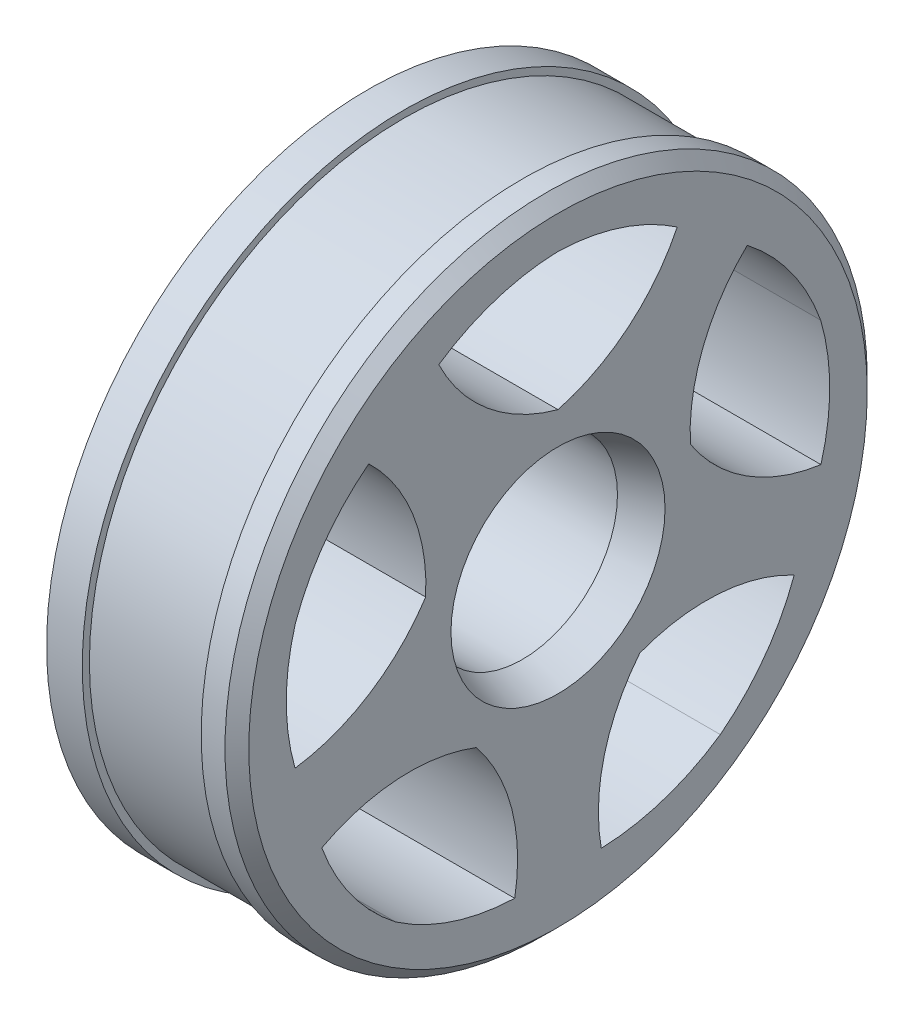
ISO-10303-21;
HEADER;
FILE_DESCRIPTION(('STEP AP214'),'2;1');
FILE_NAME('part.step','',(''),(''),'','','');
FILE_SCHEMA(('AUTOMOTIVE_DESIGN { 1 0 10303 214 1 1 1 1 }'));
ENDSEC;
DATA;
#1=APPLICATION_CONTEXT('core data for automotive mechanical design processes');
#2=APPLICATION_PROTOCOL_DEFINITION('international standard','automotive_design',2000,#1);
#3=PRODUCT_CONTEXT('',#1,'mechanical');
#4=PRODUCT('Part','Part','',(#3));
#5=PRODUCT_RELATED_PRODUCT_CATEGORY('part','',(#4));
#6=PRODUCT_DEFINITION_FORMATION('','',#4);
#7=PRODUCT_DEFINITION_CONTEXT('part definition',#1,'design');
#8=PRODUCT_DEFINITION('design','',#6,#7);
#9=PRODUCT_DEFINITION_SHAPE('','',#8);
#10=(LENGTH_UNIT() NAMED_UNIT(*) SI_UNIT(.MILLI.,.METRE.));
#11=(NAMED_UNIT(*) PLANE_ANGLE_UNIT() SI_UNIT($,.RADIAN.));
#12=(NAMED_UNIT(*) SI_UNIT($,.STERADIAN.) SOLID_ANGLE_UNIT());
#13=UNCERTAINTY_MEASURE_WITH_UNIT(LENGTH_MEASURE(1.E-05),#10,'distance_accuracy_value','');
#14=(GEOMETRIC_REPRESENTATION_CONTEXT(3) GLOBAL_UNCERTAINTY_ASSIGNED_CONTEXT((#13)) GLOBAL_UNIT_ASSIGNED_CONTEXT((#10,
#11,#12)) REPRESENTATION_CONTEXT('',''));
#15=CARTESIAN_POINT('',(0.,0.,0.));
#16=DIRECTION('',(0.,0.,1.));
#17=DIRECTION('',(1.,0.,0.));
#18=AXIS2_PLACEMENT_3D('',#15,#16,#17);
#19=CARTESIAN_POINT('',(4.,0.,0.));
#20=DIRECTION('',(-1.,0.,0.));
#21=DIRECTION('',(0.,0.,1.));
#22=AXIS2_PLACEMENT_3D('',#19,#20,#21);
#23=CYLINDRICAL_SURFACE('',#22,13.5);
#24=CARTESIAN_POINT('',(-4.,0.,0.));
#25=DIRECTION('',(1.,0.,0.));
#26=DIRECTION('',(0.,0.,-1.));
#27=AXIS2_PLACEMENT_3D('',#24,#25,#26);
#28=CIRCLE('',#27,13.5);
#29=CARTESIAN_POINT('',(-4.,0.,-13.5));
#30=VERTEX_POINT('',#29);
#31=EDGE_CURVE('E339',#30,#30,#28,.T.);
#32=ORIENTED_EDGE('',*,*,#31,.T.);
#33=EDGE_LOOP('',(#32));
#34=FACE_BOUND('',#33,.T.);
#35=CARTESIAN_POINT('',(-2.5,0.,0.));
#36=DIRECTION('',(1.,0.,0.));
#37=DIRECTION('',(0.,0.,-1.));
#38=AXIS2_PLACEMENT_3D('',#35,#36,#37);
#39=CIRCLE('',#38,13.5);
#40=CARTESIAN_POINT('',(-2.5,0.,-13.5));
#41=VERTEX_POINT('',#40);
#42=EDGE_CURVE('E253',#41,#41,#39,.T.);
#43=ORIENTED_EDGE('',*,*,#42,.F.);
#44=EDGE_LOOP('',(#43));
#45=FACE_BOUND('',#44,.T.);
#46=ADVANCED_FACE('F35',(#34,#45),#23,.T.);
#47=CARTESIAN_POINT('',(4.,0.,0.));
#48=DIRECTION('',(1.,0.,0.));
#49=DIRECTION('',(0.,0.,-1.));
#50=AXIS2_PLACEMENT_3D('',#47,#48,#49);
#51=PLANE('',#50);
#52=CARTESIAN_POINT('',(4.,0.,0.));
#53=DIRECTION('',(1.,0.,0.));
#54=DIRECTION('',(0.,0.,-1.));
#55=AXIS2_PLACEMENT_3D('',#52,#53,#54);
#56=CIRCLE('',#55,4.5);
#57=CARTESIAN_POINT('',(4.,0.,-4.5));
#58=VERTEX_POINT('',#57);
#59=EDGE_CURVE('E11',#58,#58,#56,.F.);
#60=ORIENTED_EDGE('',*,*,#59,.T.);
#61=EDGE_LOOP('',(#60));
#62=FACE_BOUND('',#61,.T.);
#63=CARTESIAN_POINT('',(4.,0.,0.));
#64=DIRECTION('',(1.,0.,0.));
#65=DIRECTION('',(0.,0.,-1.));
#66=AXIS2_PLACEMENT_3D('',#63,#64,#65);
#67=CIRCLE('',#66,13.);
#68=CARTESIAN_POINT('',(4.,0.,-13.));
#69=VERTEX_POINT('',#68);
#70=EDGE_CURVE('E342',#69,#69,#67,.T.);
#71=ORIENTED_EDGE('',*,*,#70,.T.);
#72=EDGE_LOOP('',(#71));
#73=FACE_BOUND('',#72,.T.);
#74=CARTESIAN_POINT('',(4.,0.931815794103075,-2.02933749414677));
#75=DIRECTION('',(1.,0.,0.));
#76=DIRECTION('',(0.,-0.95105651629515,-0.309016994374958));
#77=AXIS2_PLACEMENT_3D('',#74,#75,#76);
#78=CIRCLE('',#77,9.39432433543306);
#79=CARTESIAN_POINT('',(4.,-1.678595206542,-11.0536980879518));
#80=VERTEX_POINT('',#79);
#81=CARTESIAN_POINT('',(4.,3.58728925984448,-11.0405410981085));
#82=VERTEX_POINT('',#81);
#83=EDGE_CURVE('E264',#80,#82,#78,.T.);
#84=ORIENTED_EDGE('',*,*,#83,.F.);
#85=CARTESIAN_POINT('',(4.,6.08419028301145,-12.1309249973145));
#86=DIRECTION('',(1.,0.,0.));
#87=DIRECTION('',(0.,-0.95105651629515,-0.309016994374958));
#88=AXIS2_PLACEMENT_3D('',#85,#86,#87);
#89=CIRCLE('',#88,7.8371714521935);
#90=CARTESIAN_POINT('',(4.,1.80765526838161,-5.56339086038598));
#91=VERTEX_POINT('',#90);
#92=EDGE_CURVE('E262',#91,#80,#89,.T.);
#93=ORIENTED_EDGE('',*,*,#92,.F.);
#94=CARTESIAN_POINT('',(4.,2.2081654741207,-13.3903218008106));
#95=DIRECTION('',(1.,0.,0.));
#96=DIRECTION('',(0.,0.95105651629515,0.309016994374958));
#97=AXIS2_PLACEMENT_3D('',#94,#95,#96);
#98=CIRCLE('',#97,7.8371714521935);
#99=CARTESIAN_POINT('',(4.,7.85521276816055,-7.95597609686846));
#100=VERTEX_POINT('',#99);
#101=EDGE_CURVE('E268',#100,#91,#98,.T.);
#102=ORIENTED_EDGE('',*,*,#101,.F.);
#103=CARTESIAN_POINT('',(4.,0.43895983792731,-2.18947610171399));
#104=DIRECTION('',(1.,0.,0.));
#105=DIRECTION('',(0.,0.95105651629515,0.309016994374958));
#106=AXIS2_PLACEMENT_3D('',#103,#104,#105);
#107=CIRCLE('',#106,9.39432433543306);
#108=EDGE_CURVE('E266',#82,#100,#107,.T.);
#109=ORIENTED_EDGE('',*,*,#108,.F.);
#110=EDGE_LOOP('',(#84,#93,#102,#109));
#111=FACE_BOUND('',#110,.T.);
#112=CARTESIAN_POINT('',(4.,-1.64206773156553,-1.51330925598209));
#113=DIRECTION('',(1.,0.,0.));
#114=DIRECTION('',(0.,-0.58778525229248,0.809016994374942));
#115=AXIS2_PLACEMENT_3D('',#112,#113,#114);
#116=CIRCLE('',#115,9.39432433543306);
#117=CARTESIAN_POINT('',(4.,-11.0314060412036,-1.81934165046336));
#118=VERTEX_POINT('',#117);
#119=CARTESIAN_POINT('',(4.,-9.3916452097499,-6.82342965282126));
#120=VERTEX_POINT('',#119);
#121=EDGE_CURVE('E238',#118,#120,#116,.T.);
#122=ORIENTED_EDGE('',*,*,#121,.F.);
#123=CARTESIAN_POINT('',(4.,-9.65707707292231,-9.53507079669572));
#124=DIRECTION('',(1.,0.,0.));
#125=DIRECTION('',(0.,-0.58778525229248,0.809016994374942));
#126=AXIS2_PLACEMENT_3D('',#123,#124,#125);
#127=CIRCLE('',#126,7.8371714521935);
#128=CARTESIAN_POINT('',(4.,-4.73250293256568,-3.43836464441911));
#129=VERTEX_POINT('',#128);
#130=EDGE_CURVE('E236',#129,#118,#127,.T.);
#131=ORIENTED_EDGE('',*,*,#130,.F.);
#132=CARTESIAN_POINT('',(4.,-12.0525921460546,-6.23792715982025));
#133=DIRECTION('',(1.,0.,0.));
#134=DIRECTION('',(0.,0.58778525229248,-0.809016994374942));
#135=AXIS2_PLACEMENT_3D('',#132,#133,#134);
#136=CIRCLE('',#135,7.8371714521935);
#137=CARTESIAN_POINT('',(4.,-5.13918867062257,-9.92928311081719));
#138=VERTEX_POINT('',#137);
#139=EDGE_CURVE('E242',#138,#129,#136,.T.);
#140=ORIENTED_EDGE('',*,*,#139,.F.);
#141=CARTESIAN_POINT('',(4.,-1.94666946403999,-1.09406093846006));
#142=DIRECTION('',(1.,0.,0.));
#143=DIRECTION('',(0.,0.58778525229248,-0.809016994374942));
#144=AXIS2_PLACEMENT_3D('',#141,#142,#143);
#145=CIRCLE('',#144,9.39432433543306);
#146=EDGE_CURVE('E240',#120,#138,#145,.T.);
#147=ORIENTED_EDGE('',*,*,#146,.F.);
#148=EDGE_LOOP('',(#122,#131,#140,#147));
#149=FACE_BOUND('',#148,.T.);
#150=CARTESIAN_POINT('',(4.,-1.94666946404,1.09406093846003));
#151=DIRECTION('',(1.,0.,0.));
#152=DIRECTION('',(0.,0.587785252292469,0.809016994374951));
#153=AXIS2_PLACEMENT_3D('',#150,#151,#152);
#154=CIRCLE('',#153,9.39432433543306);
#155=CARTESIAN_POINT('',(4.,-5.13918867062272,9.92928311081712));
#156=VERTEX_POINT('',#155);
#157=CARTESIAN_POINT('',(4.,-9.39164520975,6.82342965282112));
#158=VERTEX_POINT('',#157);
#159=EDGE_CURVE('E211',#156,#158,#154,.T.);
#160=ORIENTED_EDGE('',*,*,#159,.F.);
#161=CARTESIAN_POINT('',(4.,-12.0525921460547,6.23792715982008));
#162=DIRECTION('',(1.,0.,0.));
#163=DIRECTION('',(0.,0.587785252292469,0.809016994374951));
#164=AXIS2_PLACEMENT_3D('',#161,#162,#163);
#165=CIRCLE('',#164,7.8371714521935);
#166=CARTESIAN_POINT('',(4.,-4.73250293256573,3.43836464441905));
#167=VERTEX_POINT('',#166);
#168=EDGE_CURVE('E180',#167,#156,#165,.T.);
#169=ORIENTED_EDGE('',*,*,#168,.F.);
#170=CARTESIAN_POINT('',(4.,-9.65707707292245,9.53507079669558));
#171=DIRECTION('',(1.,0.,0.));
#172=DIRECTION('',(0.,-0.587785252292469,-0.809016994374951));
#173=AXIS2_PLACEMENT_3D('',#170,#171,#172);
#174=CIRCLE('',#173,7.8371714521935);
#175=CARTESIAN_POINT('',(4.,-11.0314060412037,1.81934165046321));
#176=VERTEX_POINT('',#175);
#177=EDGE_CURVE('E216',#176,#167,#174,.T.);
#178=ORIENTED_EDGE('',*,*,#177,.F.);
#179=CARTESIAN_POINT('',(4.,-1.64206773156555,1.51330925598207));
#180=DIRECTION('',(1.,0.,0.));
#181=DIRECTION('',(0.,-0.587785252292469,-0.809016994374951));
#182=AXIS2_PLACEMENT_3D('',#179,#180,#181);
#183=CIRCLE('',#182,9.39432433543306);
#184=EDGE_CURVE('E213',#158,#176,#183,.T.);
#185=ORIENTED_EDGE('',*,*,#184,.F.);
#186=EDGE_LOOP('',(#160,#169,#178,#185));
#187=FACE_BOUND('',#186,.T.);
#188=CARTESIAN_POINT('',(4.,0.438959837927279,2.18947610171399));
#189=DIRECTION('',(1.,0.,0.));
#190=DIRECTION('',(0.,0.951056516295155,-0.309016994374945));
#191=AXIS2_PLACEMENT_3D('',#188,#189,#190);
#192=CIRCLE('',#191,9.39432433543306);
#193=CARTESIAN_POINT('',(4.,7.85521276816044,7.95597609686858));
#194=VERTEX_POINT('',#193);
#195=CARTESIAN_POINT('',(4.,3.58728925984432,11.0405410981086));
#196=VERTEX_POINT('',#195);
#197=EDGE_CURVE('E290',#194,#196,#192,.T.);
#198=ORIENTED_EDGE('',*,*,#197,.F.);
#199=CARTESIAN_POINT('',(4.,2.20816547412051,13.3903218008106));
#200=DIRECTION('',(1.,0.,0.));
#201=DIRECTION('',(0.,0.951056516295155,-0.309016994374945));
#202=AXIS2_PLACEMENT_3D('',#199,#200,#201);
#203=CIRCLE('',#202,7.8371714521935);
#204=CARTESIAN_POINT('',(4.,1.80765526838153,5.56339086038601));
#205=VERTEX_POINT('',#204);
#206=EDGE_CURVE('E288',#205,#194,#203,.T.);
#207=ORIENTED_EDGE('',*,*,#206,.F.);
#208=CARTESIAN_POINT('',(4.,6.08419028301128,12.1309249973146));
#209=DIRECTION('',(1.,0.,0.));
#210=DIRECTION('',(0.,-0.951056516295155,0.309016994374945));
#211=AXIS2_PLACEMENT_3D('',#208,#209,#210);
#212=CIRCLE('',#211,7.8371714521935);
#213=CARTESIAN_POINT('',(4.,-1.67859520654215,11.0536980879518));
#214=VERTEX_POINT('',#213);
#215=EDGE_CURVE('E295',#214,#205,#212,.T.);
#216=ORIENTED_EDGE('',*,*,#215,.F.);
#217=CARTESIAN_POINT('',(4.,0.931815794103047,2.02933749414678));
#218=DIRECTION('',(1.,0.,0.));
#219=DIRECTION('',(0.,-0.951056516295155,0.309016994374945));
#220=AXIS2_PLACEMENT_3D('',#217,#218,#219);
#221=CIRCLE('',#220,9.39432433543306);
#222=EDGE_CURVE('E292',#196,#214,#221,.T.);
#223=ORIENTED_EDGE('',*,*,#222,.F.);
#224=EDGE_LOOP('',(#198,#207,#216,#223));
#225=FACE_BOUND('',#224,.T.);
#226=CARTESIAN_POINT('',(4.,2.21796156357521,0.259109709954825));
#227=DIRECTION('',(1.,0.,0.));
#228=DIRECTION('',(0.,0.,-1.));
#229=AXIS2_PLACEMENT_3D('',#226,#227,#228);
#230=CIRCLE('',#229,9.39432433543306);
#231=CARTESIAN_POINT('',(4.,9.99397715020798,-5.01221946927066));
#232=VERTEX_POINT('',#231);
#233=CARTESIAN_POINT('',(4.,11.6087118998112,0.));
#234=VERTEX_POINT('',#233);
#235=EDGE_CURVE('E320',#232,#234,#230,.T.);
#236=ORIENTED_EDGE('',*,*,#235,.F.);
#237=CARTESIAN_POINT('',(4.,13.4173134618452,2.03774683337949));
#238=DIRECTION('',(1.,0.,0.));
#239=DIRECTION('',(0.,0.,-1.));
#240=AXIS2_PLACEMENT_3D('',#237,#238,#239);
#241=CIRCLE('',#240,7.8371714521935);
#242=CARTESIAN_POINT('',(4.,5.84969532836832,0.));
#243=VERTEX_POINT('',#242);
#244=EDGE_CURVE('E318',#243,#232,#241,.T.);
#245=ORIENTED_EDGE('',*,*,#244,.F.);
#246=CARTESIAN_POINT('',(4.,13.4173134618452,-2.03774683337949));
#247=DIRECTION('',(1.,0.,0.));
#248=DIRECTION('',(0.,0.,1.));
#249=AXIS2_PLACEMENT_3D('',#246,#247,#248);
#250=CIRCLE('',#249,7.8371714521935);
#251=CARTESIAN_POINT('',(4.,9.99397715020798,5.01221946927066));
#252=VERTEX_POINT('',#251);
#253=EDGE_CURVE('E325',#252,#243,#250,.T.);
#254=ORIENTED_EDGE('',*,*,#253,.F.);
#255=CARTESIAN_POINT('',(4.,2.21796156357521,-0.259109709954825));
#256=DIRECTION('',(1.,0.,0.));
#257=DIRECTION('',(0.,0.,1.));
#258=AXIS2_PLACEMENT_3D('',#255,#256,#257);
#259=CIRCLE('',#258,9.39432433543306);
#260=EDGE_CURVE('E322',#234,#252,#259,.T.);
#261=ORIENTED_EDGE('',*,*,#260,.F.);
#262=EDGE_LOOP('',(#236,#245,#254,#261));
#263=FACE_BOUND('',#262,.T.);
#264=ADVANCED_FACE('F364',(#62,#73,#111,#149,#187,#225,#263),#51,.T.);
#265=CARTESIAN_POINT('',(-4.,0.,0.));
#266=DIRECTION('',(1.,0.,0.));
#267=DIRECTION('',(0.,0.,-1.));
#268=AXIS2_PLACEMENT_3D('',#265,#266,#267);
#269=PLANE('',#268);
#270=CARTESIAN_POINT('',(-4.,6.08419028301145,-12.1309249973145));
#271=DIRECTION('',(1.,0.,0.));
#272=DIRECTION('',(0.,-0.95105651629515,-0.309016994374958));
#273=AXIS2_PLACEMENT_3D('',#270,#271,#272);
#274=CIRCLE('',#273,7.8371714521935);
#275=CARTESIAN_POINT('',(-4.,1.80765526838161,-5.56339086038598));
#276=VERTEX_POINT('',#275);
#277=CARTESIAN_POINT('',(-4.,-1.678595206542,-11.0536980879518));
#278=VERTEX_POINT('',#277);
#279=EDGE_CURVE('E249',#276,#278,#274,.T.);
#280=ORIENTED_EDGE('',*,*,#279,.T.);
#281=CARTESIAN_POINT('',(-4.,0.931815794103075,-2.02933749414677));
#282=DIRECTION('',(1.,0.,0.));
#283=DIRECTION('',(0.,-0.95105651629515,-0.309016994374958));
#284=AXIS2_PLACEMENT_3D('',#281,#282,#283);
#285=CIRCLE('',#284,9.39432433543306);
#286=CARTESIAN_POINT('',(-4.,3.58728925984448,-11.0405410981085));
#287=VERTEX_POINT('',#286);
#288=EDGE_CURVE('E252',#278,#287,#285,.T.);
#289=ORIENTED_EDGE('',*,*,#288,.T.);
#290=CARTESIAN_POINT('',(-4.,0.43895983792731,-2.18947610171399));
#291=DIRECTION('',(1.,0.,0.));
#292=DIRECTION('',(0.,0.95105651629515,0.309016994374958));
#293=AXIS2_PLACEMENT_3D('',#290,#291,#292);
#294=CIRCLE('',#293,9.39432433543306);
#295=CARTESIAN_POINT('',(-4.,7.85521276816055,-7.95597609686846));
#296=VERTEX_POINT('',#295);
#297=EDGE_CURVE('E256',#287,#296,#294,.T.);
#298=ORIENTED_EDGE('',*,*,#297,.T.);
#299=CARTESIAN_POINT('',(-4.,2.2081654741207,-13.3903218008106));
#300=DIRECTION('',(1.,0.,0.));
#301=DIRECTION('',(0.,0.95105651629515,0.309016994374958));
#302=AXIS2_PLACEMENT_3D('',#299,#300,#301);
#303=CIRCLE('',#302,7.8371714521935);
#304=EDGE_CURVE('E259',#296,#276,#303,.T.);
#305=ORIENTED_EDGE('',*,*,#304,.T.);
#306=EDGE_LOOP('',(#280,#289,#298,#305));
#307=FACE_BOUND('',#306,.T.);
#308=CARTESIAN_POINT('',(-4.,-9.65707707292231,-9.53507079669572));
#309=DIRECTION('',(1.,0.,0.));
#310=DIRECTION('',(0.,-0.58778525229248,0.809016994374942));
#311=AXIS2_PLACEMENT_3D('',#308,#309,#310);
#312=CIRCLE('',#311,7.8371714521935);
#313=CARTESIAN_POINT('',(-4.,-4.73250293256567,-3.43836464441911));
#314=VERTEX_POINT('',#313);
#315=CARTESIAN_POINT('',(-4.,-11.0314060412036,-1.81934165046336));
#316=VERTEX_POINT('',#315);
#317=EDGE_CURVE('E223',#314,#316,#312,.T.);
#318=ORIENTED_EDGE('',*,*,#317,.T.);
#319=CARTESIAN_POINT('',(-4.,-1.64206773156553,-1.51330925598209));
#320=DIRECTION('',(1.,0.,0.));
#321=DIRECTION('',(0.,-0.58778525229248,0.809016994374942));
#322=AXIS2_PLACEMENT_3D('',#319,#320,#321);
#323=CIRCLE('',#322,9.39432433543306);
#324=CARTESIAN_POINT('',(-4.,-9.3916452097499,-6.82342965282126));
#325=VERTEX_POINT('',#324);
#326=EDGE_CURVE('E226',#316,#325,#323,.T.);
#327=ORIENTED_EDGE('',*,*,#326,.T.);
#328=CARTESIAN_POINT('',(-4.,-1.94666946403999,-1.09406093846006));
#329=DIRECTION('',(1.,0.,0.));
#330=DIRECTION('',(0.,0.58778525229248,-0.809016994374942));
#331=AXIS2_PLACEMENT_3D('',#328,#329,#330);
#332=CIRCLE('',#331,9.39432433543306);
#333=CARTESIAN_POINT('',(-4.,-5.13918867062257,-9.92928311081719));
#334=VERTEX_POINT('',#333);
#335=EDGE_CURVE('E230',#325,#334,#332,.T.);
#336=ORIENTED_EDGE('',*,*,#335,.T.);
#337=CARTESIAN_POINT('',(-4.,-12.0525921460546,-6.23792715982025));
#338=DIRECTION('',(1.,0.,0.));
#339=DIRECTION('',(0.,0.58778525229248,-0.809016994374942));
#340=AXIS2_PLACEMENT_3D('',#337,#338,#339);
#341=CIRCLE('',#340,7.8371714521935);
#342=EDGE_CURVE('E233',#334,#314,#341,.T.);
#343=ORIENTED_EDGE('',*,*,#342,.T.);
#344=EDGE_LOOP('',(#318,#327,#336,#343));
#345=FACE_BOUND('',#344,.T.);
#346=CARTESIAN_POINT('',(-4.,-12.0525921460547,6.23792715982008));
#347=DIRECTION('',(1.,0.,0.));
#348=DIRECTION('',(0.,0.587785252292469,0.809016994374951));
#349=AXIS2_PLACEMENT_3D('',#346,#347,#348);
#350=CIRCLE('',#349,7.8371714521935);
#351=CARTESIAN_POINT('',(-4.,-4.73250293256573,3.43836464441905));
#352=VERTEX_POINT('',#351);
#353=CARTESIAN_POINT('',(-4.,-5.13918867062272,9.92928311081712));
#354=VERTEX_POINT('',#353);
#355=EDGE_CURVE('E177',#352,#354,#350,.T.);
#356=ORIENTED_EDGE('',*,*,#355,.T.);
#357=CARTESIAN_POINT('',(-4.,-1.94666946404,1.09406093846003));
#358=DIRECTION('',(1.,0.,0.));
#359=DIRECTION('',(0.,0.587785252292469,0.809016994374951));
#360=AXIS2_PLACEMENT_3D('',#357,#358,#359);
#361=CIRCLE('',#360,9.39432433543306);
#362=CARTESIAN_POINT('',(-4.,-9.39164520975,6.82342965282112));
#363=VERTEX_POINT('',#362);
#364=EDGE_CURVE('E187',#354,#363,#361,.T.);
#365=ORIENTED_EDGE('',*,*,#364,.T.);
#366=CARTESIAN_POINT('',(-4.,-1.64206773156555,1.51330925598207));
#367=DIRECTION('',(1.,0.,0.));
#368=DIRECTION('',(0.,-0.587785252292469,-0.809016994374951));
#369=AXIS2_PLACEMENT_3D('',#366,#367,#368);
#370=CIRCLE('',#369,9.39432433543306);
#371=CARTESIAN_POINT('',(-4.,-11.0314060412037,1.8193416504632));
#372=VERTEX_POINT('',#371);
#373=EDGE_CURVE('E193',#363,#372,#370,.T.);
#374=ORIENTED_EDGE('',*,*,#373,.T.);
#375=CARTESIAN_POINT('',(-4.,-9.65707707292245,9.53507079669558));
#376=DIRECTION('',(1.,0.,0.));
#377=DIRECTION('',(0.,-0.587785252292469,-0.809016994374951));
#378=AXIS2_PLACEMENT_3D('',#375,#376,#377);
#379=CIRCLE('',#378,7.8371714521935);
#380=EDGE_CURVE('E199',#372,#352,#379,.T.);
#381=ORIENTED_EDGE('',*,*,#380,.T.);
#382=EDGE_LOOP('',(#356,#365,#374,#381));
#383=FACE_BOUND('',#382,.T.);
#384=CARTESIAN_POINT('',(-4.,2.20816547412051,13.3903218008106));
#385=DIRECTION('',(1.,0.,0.));
#386=DIRECTION('',(0.,0.951056516295155,-0.309016994374945));
#387=AXIS2_PLACEMENT_3D('',#384,#385,#386);
#388=CIRCLE('',#387,7.8371714521935);
#389=CARTESIAN_POINT('',(-4.,1.80765526838153,5.56339086038601));
#390=VERTEX_POINT('',#389);
#391=CARTESIAN_POINT('',(-4.,7.85521276816044,7.95597609686858));
#392=VERTEX_POINT('',#391);
#393=EDGE_CURVE('E183',#390,#392,#388,.T.);
#394=ORIENTED_EDGE('',*,*,#393,.T.);
#395=CARTESIAN_POINT('',(-4.,0.438959837927279,2.18947610171399));
#396=DIRECTION('',(1.,0.,0.));
#397=DIRECTION('',(0.,0.951056516295155,-0.309016994374945));
#398=AXIS2_PLACEMENT_3D('',#395,#396,#397);
#399=CIRCLE('',#398,9.39432433543306);
#400=CARTESIAN_POINT('',(-4.,3.58728925984432,11.0405410981086));
#401=VERTEX_POINT('',#400);
#402=EDGE_CURVE('E279',#392,#401,#399,.T.);
#403=ORIENTED_EDGE('',*,*,#402,.T.);
#404=CARTESIAN_POINT('',(-4.,0.931815794103047,2.02933749414678));
#405=DIRECTION('',(1.,0.,0.));
#406=DIRECTION('',(0.,-0.951056516295155,0.309016994374945));
#407=AXIS2_PLACEMENT_3D('',#404,#405,#406);
#408=CIRCLE('',#407,9.39432433543306);
#409=CARTESIAN_POINT('',(-4.,-1.67859520654215,11.0536980879518));
#410=VERTEX_POINT('',#409);
#411=EDGE_CURVE('E282',#401,#410,#408,.T.);
#412=ORIENTED_EDGE('',*,*,#411,.T.);
#413=CARTESIAN_POINT('',(-4.,6.08419028301128,12.1309249973146));
#414=DIRECTION('',(1.,0.,0.));
#415=DIRECTION('',(0.,-0.951056516295155,0.309016994374945));
#416=AXIS2_PLACEMENT_3D('',#413,#414,#415);
#417=CIRCLE('',#416,7.8371714521935);
#418=EDGE_CURVE('E285',#410,#390,#417,.T.);
#419=ORIENTED_EDGE('',*,*,#418,.T.);
#420=EDGE_LOOP('',(#394,#403,#412,#419));
#421=FACE_BOUND('',#420,.T.);
#422=CARTESIAN_POINT('',(-4.,13.4173134618452,2.03774683337949));
#423=DIRECTION('',(1.,0.,0.));
#424=DIRECTION('',(0.,0.,-1.));
#425=AXIS2_PLACEMENT_3D('',#422,#423,#424);
#426=CIRCLE('',#425,7.8371714521935);
#427=CARTESIAN_POINT('',(-4.,5.84969532836832,0.));
#428=VERTEX_POINT('',#427);
#429=CARTESIAN_POINT('',(-4.,9.99397715020798,-5.01221946927066));
#430=VERTEX_POINT('',#429);
#431=EDGE_CURVE('E306',#428,#430,#426,.T.);
#432=ORIENTED_EDGE('',*,*,#431,.T.);
#433=CARTESIAN_POINT('',(-4.,2.21796156357521,0.259109709954825));
#434=DIRECTION('',(1.,0.,0.));
#435=DIRECTION('',(0.,0.,-1.));
#436=AXIS2_PLACEMENT_3D('',#433,#434,#435);
#437=CIRCLE('',#436,9.39432433543306);
#438=CARTESIAN_POINT('',(-4.,11.6087118998112,0.));
#439=VERTEX_POINT('',#438);
#440=EDGE_CURVE('E309',#430,#439,#437,.T.);
#441=ORIENTED_EDGE('',*,*,#440,.T.);
#442=CARTESIAN_POINT('',(-4.,2.21796156357521,-0.259109709954825));
#443=DIRECTION('',(1.,0.,0.));
#444=DIRECTION('',(0.,0.,1.));
#445=AXIS2_PLACEMENT_3D('',#442,#443,#444);
#446=CIRCLE('',#445,9.39432433543306);
#447=CARTESIAN_POINT('',(-4.,9.99397715020798,5.01221946927066));
#448=VERTEX_POINT('',#447);
#449=EDGE_CURVE('E312',#439,#448,#446,.T.);
#450=ORIENTED_EDGE('',*,*,#449,.T.);
#451=CARTESIAN_POINT('',(-4.,13.4173134618452,-2.03774683337949));
#452=DIRECTION('',(1.,0.,0.));
#453=DIRECTION('',(0.,0.,1.));
#454=AXIS2_PLACEMENT_3D('',#451,#452,#453);
#455=CIRCLE('',#454,7.8371714521935);
#456=EDGE_CURVE('E315',#448,#428,#455,.T.);
#457=ORIENTED_EDGE('',*,*,#456,.T.);
#458=EDGE_LOOP('',(#432,#441,#450,#457));
#459=FACE_BOUND('',#458,.T.);
#460=ORIENTED_EDGE('',*,*,#31,.F.);
#461=EDGE_LOOP('',(#460));
#462=FACE_BOUND('',#461,.T.);
#463=CARTESIAN_POINT('',(-4.,0.,0.));
#464=DIRECTION('',(1.,0.,0.));
#465=DIRECTION('',(0.,0.,-1.));
#466=AXIS2_PLACEMENT_3D('',#463,#464,#465);
#467=CIRCLE('',#466,4.);
#468=CARTESIAN_POINT('',(-4.,0.,-4.));
#469=VERTEX_POINT('',#468);
#470=EDGE_CURVE('E336',#469,#469,#467,.T.);
#471=ORIENTED_EDGE('',*,*,#470,.T.);
#472=EDGE_LOOP('',(#471));
#473=FACE_BOUND('',#472,.T.);
#474=ADVANCED_FACE('F196',(#307,#345,#383,#421,#459,#462,#473),#269,.F.);
#475=CARTESIAN_POINT('',(2.5,0.,0.));
#476=DIRECTION('',(1.,0.,0.));
#477=DIRECTION('',(0.,0.,-1.));
#478=AXIS2_PLACEMENT_3D('',#475,#476,#477);
#479=CIRCLE('',#478,13.5);
#480=CARTESIAN_POINT('',(2.5,0.,-13.5));
#481=VERTEX_POINT('',#480);
#482=EDGE_CURVE('E205',#481,#481,#479,.T.);
#483=ORIENTED_EDGE('',*,*,#482,.T.);
#484=EDGE_LOOP('',(#483));
#485=FACE_BOUND('',#484,.T.);
#486=CARTESIAN_POINT('',(3.5,0.,0.));
#487=DIRECTION('',(1.,0.,0.));
#488=DIRECTION('',(0.,0.,-1.));
#489=AXIS2_PLACEMENT_3D('',#486,#487,#488);
#490=CIRCLE('',#489,13.5);
#491=CARTESIAN_POINT('',(3.5,0.,-13.5));
#492=VERTEX_POINT('',#491);
#493=EDGE_CURVE('E345',#492,#492,#490,.F.);
#494=ORIENTED_EDGE('',*,*,#493,.T.);
#495=EDGE_LOOP('',(#494));
#496=FACE_BOUND('',#495,.T.);
#497=ADVANCED_FACE('F367',(#485,#496),#23,.T.);
#498=CARTESIAN_POINT('',(4.,0.,0.));
#499=DIRECTION('',(-1.,0.,0.));
#500=DIRECTION('',(0.,0.,1.));
#501=AXIS2_PLACEMENT_3D('',#498,#499,#500);
#502=CYLINDRICAL_SURFACE('',#501,4.);
#503=CARTESIAN_POINT('',(2.49999999999998,0.,0.));
#504=DIRECTION('',(1.,0.,0.));
#505=DIRECTION('',(0.,0.,-1.));
#506=AXIS2_PLACEMENT_3D('',#503,#504,#505);
#507=CIRCLE('',#506,4.);
#508=CARTESIAN_POINT('',(2.49999999999998,0.,-4.));
#509=VERTEX_POINT('',#508);
#510=EDGE_CURVE('E44',#509,#509,#507,.T.);
#511=ORIENTED_EDGE('',*,*,#510,.T.);
#512=EDGE_LOOP('',(#511));
#513=FACE_BOUND('',#512,.T.);
#514=ORIENTED_EDGE('',*,*,#470,.F.);
#515=EDGE_LOOP('',(#514));
#516=FACE_BOUND('',#515,.T.);
#517=ADVANCED_FACE('F350',(#513,#516),#502,.F.);
#518=CARTESIAN_POINT('',(4.,13.4173134618452,2.03774683337949));
#519=DIRECTION('',(-1.,0.,0.));
#520=DIRECTION('',(0.,0.,1.));
#521=AXIS2_PLACEMENT_3D('',#518,#519,#520);
#522=CYLINDRICAL_SURFACE('',#521,7.8371714521935);
#523=DIRECTION('',(-1.,0.,0.));
#524=VECTOR('',#523,1.);
#525=CARTESIAN_POINT('',(4.,5.84969532836832,0.));
#526=LINE('',#525,#524);
#527=EDGE_CURVE('E327',#243,#428,#526,.T.);
#528=ORIENTED_EDGE('',*,*,#527,.F.);
#529=ORIENTED_EDGE('',*,*,#244,.T.);
#530=DIRECTION('',(-1.,0.,0.));
#531=VECTOR('',#530,1.);
#532=CARTESIAN_POINT('',(4.,9.99397715020798,-5.01221946927066));
#533=LINE('',#532,#531);
#534=EDGE_CURVE('E334',#232,#430,#533,.T.);
#535=ORIENTED_EDGE('',*,*,#534,.T.);
#536=ORIENTED_EDGE('',*,*,#431,.F.);
#537=EDGE_LOOP('',(#528,#529,#535,#536));
#538=FACE_BOUND('',#537,.T.);
#539=ADVANCED_FACE('F381',(#538),#522,.F.);
#540=CARTESIAN_POINT('',(4.,2.21796156357521,0.259109709954825));
#541=DIRECTION('',(-1.,0.,0.));
#542=DIRECTION('',(0.,0.,1.));
#543=AXIS2_PLACEMENT_3D('',#540,#541,#542);
#544=CYLINDRICAL_SURFACE('',#543,9.39432433543306);
#545=ORIENTED_EDGE('',*,*,#534,.F.);
#546=ORIENTED_EDGE('',*,*,#235,.T.);
#547=DIRECTION('',(-1.,0.,0.));
#548=VECTOR('',#547,1.);
#549=CARTESIAN_POINT('',(4.,11.6087118998112,0.));
#550=LINE('',#549,#548);
#551=EDGE_CURVE('E332',#234,#439,#550,.T.);
#552=ORIENTED_EDGE('',*,*,#551,.T.);
#553=ORIENTED_EDGE('',*,*,#440,.F.);
#554=EDGE_LOOP('',(#545,#546,#552,#553));
#555=FACE_BOUND('',#554,.T.);
#556=ADVANCED_FACE('F418',(#555),#544,.F.);
#557=CARTESIAN_POINT('',(4.,2.21796156357521,-0.259109709954825));
#558=DIRECTION('',(-1.,0.,0.));
#559=DIRECTION('',(0.,0.,1.));
#560=AXIS2_PLACEMENT_3D('',#557,#558,#559);
#561=CYLINDRICAL_SURFACE('',#560,9.39432433543306);
#562=ORIENTED_EDGE('',*,*,#551,.F.);
#563=ORIENTED_EDGE('',*,*,#260,.T.);
#564=DIRECTION('',(-1.,0.,0.));
#565=VECTOR('',#564,1.);
#566=CARTESIAN_POINT('',(4.,9.99397715020798,5.01221946927066));
#567=LINE('',#566,#565);
#568=EDGE_CURVE('E330',#252,#448,#567,.T.);
#569=ORIENTED_EDGE('',*,*,#568,.T.);
#570=ORIENTED_EDGE('',*,*,#449,.F.);
#571=EDGE_LOOP('',(#562,#563,#569,#570));
#572=FACE_BOUND('',#571,.T.);
#573=ADVANCED_FACE('F422',(#572),#561,.F.);
#574=CARTESIAN_POINT('',(4.,13.4173134618452,-2.03774683337949));
#575=DIRECTION('',(-1.,0.,0.));
#576=DIRECTION('',(0.,0.,1.));
#577=AXIS2_PLACEMENT_3D('',#574,#575,#576);
#578=CYLINDRICAL_SURFACE('',#577,7.8371714521935);
#579=ORIENTED_EDGE('',*,*,#568,.F.);
#580=ORIENTED_EDGE('',*,*,#253,.T.);
#581=ORIENTED_EDGE('',*,*,#527,.T.);
#582=ORIENTED_EDGE('',*,*,#456,.F.);
#583=EDGE_LOOP('',(#579,#580,#581,#582));
#584=FACE_BOUND('',#583,.T.);
#585=ADVANCED_FACE('F429',(#584),#578,.F.);
#586=CARTESIAN_POINT('',(4.,2.20816547412051,13.3903218008106));
#587=DIRECTION('',(-1.,0.,0.));
#588=DIRECTION('',(0.,0.,1.));
#589=AXIS2_PLACEMENT_3D('',#586,#587,#588);
#590=CYLINDRICAL_SURFACE('',#589,7.8371714521935);
#591=DIRECTION('',(-1.,0.,0.));
#592=VECTOR('',#591,1.);
#593=CARTESIAN_POINT('',(4.,1.80765526838153,5.56339086038601));
#594=LINE('',#593,#592);
#595=EDGE_CURVE('E297',#205,#390,#594,.T.);
#596=ORIENTED_EDGE('',*,*,#595,.F.);
#597=ORIENTED_EDGE('',*,*,#206,.T.);
#598=DIRECTION('',(-1.,0.,0.));
#599=VECTOR('',#598,1.);
#600=CARTESIAN_POINT('',(4.,7.85521276816044,7.95597609686858));
#601=LINE('',#600,#599);
#602=EDGE_CURVE('E304',#194,#392,#601,.T.);
#603=ORIENTED_EDGE('',*,*,#602,.T.);
#604=ORIENTED_EDGE('',*,*,#393,.F.);
#605=EDGE_LOOP('',(#596,#597,#603,#604));
#606=FACE_BOUND('',#605,.T.);
#607=ADVANCED_FACE('F431',(#606),#590,.F.);
#608=CARTESIAN_POINT('',(4.,0.438959837927279,2.18947610171399));
#609=DIRECTION('',(-1.,0.,0.));
#610=DIRECTION('',(0.,0.,1.));
#611=AXIS2_PLACEMENT_3D('',#608,#609,#610);
#612=CYLINDRICAL_SURFACE('',#611,9.39432433543306);
#613=ORIENTED_EDGE('',*,*,#602,.F.);
#614=ORIENTED_EDGE('',*,*,#197,.T.);
#615=DIRECTION('',(-1.,0.,0.));
#616=VECTOR('',#615,1.);
#617=CARTESIAN_POINT('',(4.,3.58728925984432,11.0405410981086));
#618=LINE('',#617,#616);
#619=EDGE_CURVE('E302',#196,#401,#618,.T.);
#620=ORIENTED_EDGE('',*,*,#619,.T.);
#621=ORIENTED_EDGE('',*,*,#402,.F.);
#622=EDGE_LOOP('',(#613,#614,#620,#621));
#623=FACE_BOUND('',#622,.T.);
#624=ADVANCED_FACE('F437',(#623),#612,.F.);
#625=CARTESIAN_POINT('',(4.,0.931815794103047,2.02933749414678));
#626=DIRECTION('',(-1.,0.,0.));
#627=DIRECTION('',(0.,0.,1.));
#628=AXIS2_PLACEMENT_3D('',#625,#626,#627);
#629=CYLINDRICAL_SURFACE('',#628,9.39432433543306);
#630=ORIENTED_EDGE('',*,*,#619,.F.);
#631=ORIENTED_EDGE('',*,*,#222,.T.);
#632=DIRECTION('',(-1.,0.,0.));
#633=VECTOR('',#632,1.);
#634=CARTESIAN_POINT('',(4.,-1.67859520654215,11.0536980879518));
#635=LINE('',#634,#633);
#636=EDGE_CURVE('E300',#214,#410,#635,.T.);
#637=ORIENTED_EDGE('',*,*,#636,.T.);
#638=ORIENTED_EDGE('',*,*,#411,.F.);
#639=EDGE_LOOP('',(#630,#631,#637,#638));
#640=FACE_BOUND('',#639,.T.);
#641=ADVANCED_FACE('F485',(#640),#629,.F.);
#642=CARTESIAN_POINT('',(4.,6.08419028301128,12.1309249973146));
#643=DIRECTION('',(-1.,0.,0.));
#644=DIRECTION('',(0.,0.,1.));
#645=AXIS2_PLACEMENT_3D('',#642,#643,#644);
#646=CYLINDRICAL_SURFACE('',#645,7.8371714521935);
#647=ORIENTED_EDGE('',*,*,#636,.F.);
#648=ORIENTED_EDGE('',*,*,#215,.T.);
#649=ORIENTED_EDGE('',*,*,#595,.T.);
#650=ORIENTED_EDGE('',*,*,#418,.F.);
#651=EDGE_LOOP('',(#647,#648,#649,#650));
#652=FACE_BOUND('',#651,.T.);
#653=ADVANCED_FACE('F494',(#652),#646,.F.);
#654=CARTESIAN_POINT('',(4.,-12.0525921460547,6.23792715982008));
#655=DIRECTION('',(-1.,0.,0.));
#656=DIRECTION('',(0.,0.,1.));
#657=AXIS2_PLACEMENT_3D('',#654,#655,#656);
#658=CYLINDRICAL_SURFACE('',#657,7.8371714521935);
#659=DIRECTION('',(-1.,0.,0.));
#660=VECTOR('',#659,1.);
#661=CARTESIAN_POINT('',(4.,-4.73250293256573,3.43836464441905));
#662=LINE('',#661,#660);
#663=EDGE_CURVE('E218',#167,#352,#662,.T.);
#664=ORIENTED_EDGE('',*,*,#663,.F.);
#665=ORIENTED_EDGE('',*,*,#168,.T.);
#666=DIRECTION('',(-1.,0.,0.));
#667=VECTOR('',#666,1.);
#668=CARTESIAN_POINT('',(4.,-5.13918867062272,9.92928311081712));
#669=LINE('',#668,#667);
#670=EDGE_CURVE('E172',#156,#354,#669,.T.);
#671=ORIENTED_EDGE('',*,*,#670,.T.);
#672=ORIENTED_EDGE('',*,*,#355,.F.);
#673=EDGE_LOOP('',(#664,#665,#671,#672));
#674=FACE_BOUND('',#673,.T.);
#675=ADVANCED_FACE('F175',(#674),#658,.F.);
#676=CARTESIAN_POINT('',(4.,-1.94666946404,1.09406093846003));
#677=DIRECTION('',(-1.,0.,0.));
#678=DIRECTION('',(0.,0.,1.));
#679=AXIS2_PLACEMENT_3D('',#676,#677,#678);
#680=CYLINDRICAL_SURFACE('',#679,9.39432433543306);
#681=ORIENTED_EDGE('',*,*,#670,.F.);
#682=ORIENTED_EDGE('',*,*,#159,.T.);
#683=DIRECTION('',(-1.,0.,0.));
#684=VECTOR('',#683,1.);
#685=CARTESIAN_POINT('',(4.,-9.39164520975,6.82342965282112));
#686=LINE('',#685,#684);
#687=EDGE_CURVE('E184',#158,#363,#686,.T.);
#688=ORIENTED_EDGE('',*,*,#687,.T.);
#689=ORIENTED_EDGE('',*,*,#364,.F.);
#690=EDGE_LOOP('',(#681,#682,#688,#689));
#691=FACE_BOUND('',#690,.T.);
#692=ADVANCED_FACE('F188',(#691),#680,.F.);
#693=CARTESIAN_POINT('',(4.,-1.64206773156555,1.51330925598207));
#694=DIRECTION('',(-1.,0.,0.));
#695=DIRECTION('',(0.,0.,1.));
#696=AXIS2_PLACEMENT_3D('',#693,#694,#695);
#697=CYLINDRICAL_SURFACE('',#696,9.39432433543306);
#698=ORIENTED_EDGE('',*,*,#687,.F.);
#699=ORIENTED_EDGE('',*,*,#184,.T.);
#700=DIRECTION('',(-1.,0.,0.));
#701=VECTOR('',#700,1.);
#702=CARTESIAN_POINT('',(4.,-11.0314060412037,1.8193416504632));
#703=LINE('',#702,#701);
#704=EDGE_CURVE('E220',#176,#372,#703,.T.);
#705=ORIENTED_EDGE('',*,*,#704,.T.);
#706=ORIENTED_EDGE('',*,*,#373,.F.);
#707=EDGE_LOOP('',(#698,#699,#705,#706));
#708=FACE_BOUND('',#707,.T.);
#709=ADVANCED_FACE('F521',(#708),#697,.F.);
#710=CARTESIAN_POINT('',(4.,-9.65707707292245,9.53507079669558));
#711=DIRECTION('',(-1.,0.,0.));
#712=DIRECTION('',(0.,0.,1.));
#713=AXIS2_PLACEMENT_3D('',#710,#711,#712);
#714=CYLINDRICAL_SURFACE('',#713,7.8371714521935);
#715=ORIENTED_EDGE('',*,*,#704,.F.);
#716=ORIENTED_EDGE('',*,*,#177,.T.);
#717=ORIENTED_EDGE('',*,*,#663,.T.);
#718=ORIENTED_EDGE('',*,*,#380,.F.);
#719=EDGE_LOOP('',(#715,#716,#717,#718));
#720=FACE_BOUND('',#719,.T.);
#721=ADVANCED_FACE('F530',(#720),#714,.F.);
#722=CARTESIAN_POINT('',(4.,-9.65707707292231,-9.53507079669572));
#723=DIRECTION('',(-1.,0.,0.));
#724=DIRECTION('',(0.,0.,1.));
#725=AXIS2_PLACEMENT_3D('',#722,#723,#724);
#726=CYLINDRICAL_SURFACE('',#725,7.8371714521935);
#727=DIRECTION('',(-1.,0.,0.));
#728=VECTOR('',#727,1.);
#729=CARTESIAN_POINT('',(4.,-4.73250293256568,-3.43836464441911));
#730=LINE('',#729,#728);
#731=EDGE_CURVE('E244',#129,#314,#730,.T.);
#732=ORIENTED_EDGE('',*,*,#731,.F.);
#733=ORIENTED_EDGE('',*,*,#130,.T.);
#734=DIRECTION('',(-1.,0.,0.));
#735=VECTOR('',#734,1.);
#736=CARTESIAN_POINT('',(4.,-11.0314060412036,-1.81934165046336));
#737=LINE('',#736,#735);
#738=EDGE_CURVE('E200',#118,#316,#737,.T.);
#739=ORIENTED_EDGE('',*,*,#738,.T.);
#740=ORIENTED_EDGE('',*,*,#317,.F.);
#741=EDGE_LOOP('',(#732,#733,#739,#740));
#742=FACE_BOUND('',#741,.T.);
#743=ADVANCED_FACE('F540',(#742),#726,.F.);
#744=CARTESIAN_POINT('',(4.,-1.64206773156553,-1.51330925598209));
#745=DIRECTION('',(-1.,0.,0.));
#746=DIRECTION('',(0.,0.,1.));
#747=AXIS2_PLACEMENT_3D('',#744,#745,#746);
#748=CYLINDRICAL_SURFACE('',#747,9.39432433543306);
#749=ORIENTED_EDGE('',*,*,#738,.F.);
#750=ORIENTED_EDGE('',*,*,#121,.T.);
#751=DIRECTION('',(-1.,0.,0.));
#752=VECTOR('',#751,1.);
#753=CARTESIAN_POINT('',(4.,-9.3916452097499,-6.82342965282126));
#754=LINE('',#753,#752);
#755=EDGE_CURVE('E202',#120,#325,#754,.T.);
#756=ORIENTED_EDGE('',*,*,#755,.T.);
#757=ORIENTED_EDGE('',*,*,#326,.F.);
#758=EDGE_LOOP('',(#749,#750,#756,#757));
#759=FACE_BOUND('',#758,.T.);
#760=ADVANCED_FACE('F550',(#759),#748,.F.);
#761=CARTESIAN_POINT('',(4.,-1.94666946403999,-1.09406093846006));
#762=DIRECTION('',(-1.,0.,0.));
#763=DIRECTION('',(0.,0.,1.));
#764=AXIS2_PLACEMENT_3D('',#761,#762,#763);
#765=CYLINDRICAL_SURFACE('',#764,9.39432433543306);
#766=ORIENTED_EDGE('',*,*,#755,.F.);
#767=ORIENTED_EDGE('',*,*,#146,.T.);
#768=DIRECTION('',(-1.,0.,0.));
#769=VECTOR('',#768,1.);
#770=CARTESIAN_POINT('',(4.,-5.13918867062257,-9.92928311081719));
#771=LINE('',#770,#769);
#772=EDGE_CURVE('E59',#138,#334,#771,.T.);
#773=ORIENTED_EDGE('',*,*,#772,.T.);
#774=ORIENTED_EDGE('',*,*,#335,.F.);
#775=EDGE_LOOP('',(#766,#767,#773,#774));
#776=FACE_BOUND('',#775,.T.);
#777=ADVANCED_FACE('F560',(#776),#765,.F.);
#778=CARTESIAN_POINT('',(4.,-12.0525921460546,-6.23792715982025));
#779=DIRECTION('',(-1.,0.,0.));
#780=DIRECTION('',(0.,0.,1.));
#781=AXIS2_PLACEMENT_3D('',#778,#779,#780);
#782=CYLINDRICAL_SURFACE('',#781,7.8371714521935);
#783=ORIENTED_EDGE('',*,*,#772,.F.);
#784=ORIENTED_EDGE('',*,*,#139,.T.);
#785=ORIENTED_EDGE('',*,*,#731,.T.);
#786=ORIENTED_EDGE('',*,*,#342,.F.);
#787=EDGE_LOOP('',(#783,#784,#785,#786));
#788=FACE_BOUND('',#787,.T.);
#789=ADVANCED_FACE('F570',(#788),#782,.F.);
#790=CARTESIAN_POINT('',(4.,6.08419028301145,-12.1309249973145));
#791=DIRECTION('',(-1.,0.,0.));
#792=DIRECTION('',(0.,0.,1.));
#793=AXIS2_PLACEMENT_3D('',#790,#791,#792);
#794=CYLINDRICAL_SURFACE('',#793,7.8371714521935);
#795=DIRECTION('',(-1.,0.,0.));
#796=VECTOR('',#795,1.);
#797=CARTESIAN_POINT('',(4.,1.80765526838161,-5.56339086038598));
#798=LINE('',#797,#796);
#799=EDGE_CURVE('E270',#91,#276,#798,.T.);
#800=ORIENTED_EDGE('',*,*,#799,.F.);
#801=ORIENTED_EDGE('',*,*,#92,.T.);
#802=DIRECTION('',(-1.,0.,0.));
#803=VECTOR('',#802,1.);
#804=CARTESIAN_POINT('',(4.,-1.678595206542,-11.0536980879518));
#805=LINE('',#804,#803);
#806=EDGE_CURVE('E227',#80,#278,#805,.T.);
#807=ORIENTED_EDGE('',*,*,#806,.T.);
#808=ORIENTED_EDGE('',*,*,#279,.F.);
#809=EDGE_LOOP('',(#800,#801,#807,#808));
#810=FACE_BOUND('',#809,.T.);
#811=ADVANCED_FACE('F580',(#810),#794,.F.);
#812=CARTESIAN_POINT('',(4.,0.931815794103075,-2.02933749414677));
#813=DIRECTION('',(-1.,0.,0.));
#814=DIRECTION('',(0.,0.,1.));
#815=AXIS2_PLACEMENT_3D('',#812,#813,#814);
#816=CYLINDRICAL_SURFACE('',#815,9.39432433543306);
#817=ORIENTED_EDGE('',*,*,#806,.F.);
#818=ORIENTED_EDGE('',*,*,#83,.T.);
#819=DIRECTION('',(-1.,0.,0.));
#820=VECTOR('',#819,1.);
#821=CARTESIAN_POINT('',(4.,3.58728925984448,-11.0405410981085));
#822=LINE('',#821,#820);
#823=EDGE_CURVE('E274',#82,#287,#822,.T.);
#824=ORIENTED_EDGE('',*,*,#823,.T.);
#825=ORIENTED_EDGE('',*,*,#288,.F.);
#826=EDGE_LOOP('',(#817,#818,#824,#825));
#827=FACE_BOUND('',#826,.T.);
#828=ADVANCED_FACE('F589',(#827),#816,.F.);
#829=CARTESIAN_POINT('',(4.,0.43895983792731,-2.18947610171399));
#830=DIRECTION('',(-1.,0.,0.));
#831=DIRECTION('',(0.,0.,1.));
#832=AXIS2_PLACEMENT_3D('',#829,#830,#831);
#833=CYLINDRICAL_SURFACE('',#832,9.39432433543306);
#834=ORIENTED_EDGE('',*,*,#823,.F.);
#835=ORIENTED_EDGE('',*,*,#108,.T.);
#836=DIRECTION('',(-1.,0.,0.));
#837=VECTOR('',#836,1.);
#838=CARTESIAN_POINT('',(4.,7.85521276816055,-7.95597609686846));
#839=LINE('',#838,#837);
#840=EDGE_CURVE('E51',#100,#296,#839,.T.);
#841=ORIENTED_EDGE('',*,*,#840,.T.);
#842=ORIENTED_EDGE('',*,*,#297,.F.);
#843=EDGE_LOOP('',(#834,#835,#841,#842));
#844=FACE_BOUND('',#843,.T.);
#845=ADVANCED_FACE('F599',(#844),#833,.F.);
#846=CARTESIAN_POINT('',(4.,2.2081654741207,-13.3903218008106));
#847=DIRECTION('',(-1.,0.,0.));
#848=DIRECTION('',(0.,0.,1.));
#849=AXIS2_PLACEMENT_3D('',#846,#847,#848);
#850=CYLINDRICAL_SURFACE('',#849,7.8371714521935);
#851=ORIENTED_EDGE('',*,*,#840,.F.);
#852=ORIENTED_EDGE('',*,*,#101,.T.);
#853=ORIENTED_EDGE('',*,*,#799,.T.);
#854=ORIENTED_EDGE('',*,*,#304,.F.);
#855=EDGE_LOOP('',(#851,#852,#853,#854));
#856=FACE_BOUND('',#855,.T.);
#857=ADVANCED_FACE('F393',(#856),#850,.F.);
#858=CARTESIAN_POINT('',(4.,0.,0.));
#859=DIRECTION('',(-1.,0.,0.));
#860=DIRECTION('',(0.,0.,1.));
#861=AXIS2_PLACEMENT_3D('',#858,#859,#860);
#862=CONICAL_SURFACE('',#861,13.,0.785398163397443);
#863=ORIENTED_EDGE('',*,*,#493,.F.);
#864=EDGE_LOOP('',(#863));
#865=FACE_BOUND('',#864,.T.);
#866=ORIENTED_EDGE('',*,*,#70,.F.);
#867=EDGE_LOOP('',(#866));
#868=FACE_BOUND('',#867,.T.);
#869=ADVANCED_FACE('F389',(#865,#868),#862,.T.);
#870=CARTESIAN_POINT('',(-2.5,0.,0.));
#871=DIRECTION('',(1.,0.,0.));
#872=DIRECTION('',(0.,0.,-1.));
#873=AXIS2_PLACEMENT_3D('',#870,#871,#872);
#874=PLANE('',#873);
#875=CARTESIAN_POINT('',(-2.5,0.,0.));
#876=DIRECTION('',(1.,0.,0.));
#877=DIRECTION('',(0.,0.,-1.));
#878=AXIS2_PLACEMENT_3D('',#875,#876,#877);
#879=CIRCLE('',#878,13.2);
#880=CARTESIAN_POINT('',(-2.5,0.,-13.2));
#881=VERTEX_POINT('',#880);
#882=EDGE_CURVE('E679',#881,#881,#879,.T.);
#883=ORIENTED_EDGE('',*,*,#882,.F.);
#884=EDGE_LOOP('',(#883));
#885=FACE_BOUND('',#884,.T.);
#886=ORIENTED_EDGE('',*,*,#42,.T.);
#887=EDGE_LOOP('',(#886));
#888=FACE_BOUND('',#887,.T.);
#889=ADVANCED_FACE('F392',(#885,#888),#874,.T.);
#890=CARTESIAN_POINT('',(2.5,0.,0.));
#891=DIRECTION('',(1.,0.,0.));
#892=DIRECTION('',(0.,0.,-1.));
#893=AXIS2_PLACEMENT_3D('',#890,#891,#892);
#894=PLANE('',#893);
#895=CARTESIAN_POINT('',(2.5,0.,0.));
#896=DIRECTION('',(1.,0.,0.));
#897=DIRECTION('',(0.,0.,-1.));
#898=AXIS2_PLACEMENT_3D('',#895,#896,#897);
#899=CIRCLE('',#898,13.2);
#900=CARTESIAN_POINT('',(2.5,0.,-13.2));
#901=VERTEX_POINT('',#900);
#902=EDGE_CURVE('E678',#901,#901,#899,.T.);
#903=ORIENTED_EDGE('',*,*,#902,.T.);
#904=EDGE_LOOP('',(#903));
#905=FACE_BOUND('',#904,.T.);
#906=ORIENTED_EDGE('',*,*,#482,.F.);
#907=EDGE_LOOP('',(#906));
#908=FACE_BOUND('',#907,.T.);
#909=ADVANCED_FACE('F359',(#905,#908),#894,.F.);
#910=CARTESIAN_POINT('',(-2.5,0.,0.));
#911=DIRECTION('',(1.,0.,0.));
#912=DIRECTION('',(0.,0.,-1.));
#913=AXIS2_PLACEMENT_3D('',#910,#911,#912);
#914=CYLINDRICAL_SURFACE('',#913,13.2);
#915=ORIENTED_EDGE('',*,*,#882,.T.);
#916=EDGE_LOOP('',(#915));
#917=FACE_BOUND('',#916,.T.);
#918=ORIENTED_EDGE('',*,*,#902,.F.);
#919=EDGE_LOOP('',(#918));
#920=FACE_BOUND('',#919,.T.);
#921=ADVANCED_FACE('F354',(#917,#920),#914,.T.);
#922=CARTESIAN_POINT('',(2.49999999999998,0.,0.));
#923=DIRECTION('',(1.,0.,0.));
#924=DIRECTION('',(0.,0.,-1.));
#925=AXIS2_PLACEMENT_3D('',#922,#923,#924);
#926=CONICAL_SURFACE('',#925,4.,0.321750554396638);
#927=ORIENTED_EDGE('',*,*,#59,.F.);
#928=EDGE_LOOP('',(#927));
#929=FACE_BOUND('',#928,.T.);
#930=ORIENTED_EDGE('',*,*,#510,.F.);
#931=EDGE_LOOP('',(#930));
#932=FACE_BOUND('',#931,.T.);
#933=ADVANCED_FACE('F38',(#929,#932),#926,.F.);
#934=CLOSED_SHELL('',(#46,#264,#474,#497,#517,#539,#556,#573,#585,#607,#624,#641,#653,#675,#692,
#709,#721,#743,#760,#777,#789,#811,#828,#845,#857,#869,#889,#909,#921,#933));
#935=MANIFOLD_SOLID_BREP('B2',#934);
#936=ADVANCED_BREP_SHAPE_REPRESENTATION('',(#18,#935),#14);
#937=SHAPE_DEFINITION_REPRESENTATION(#9,#936);
ENDSEC;
END-ISO-10303-21;
